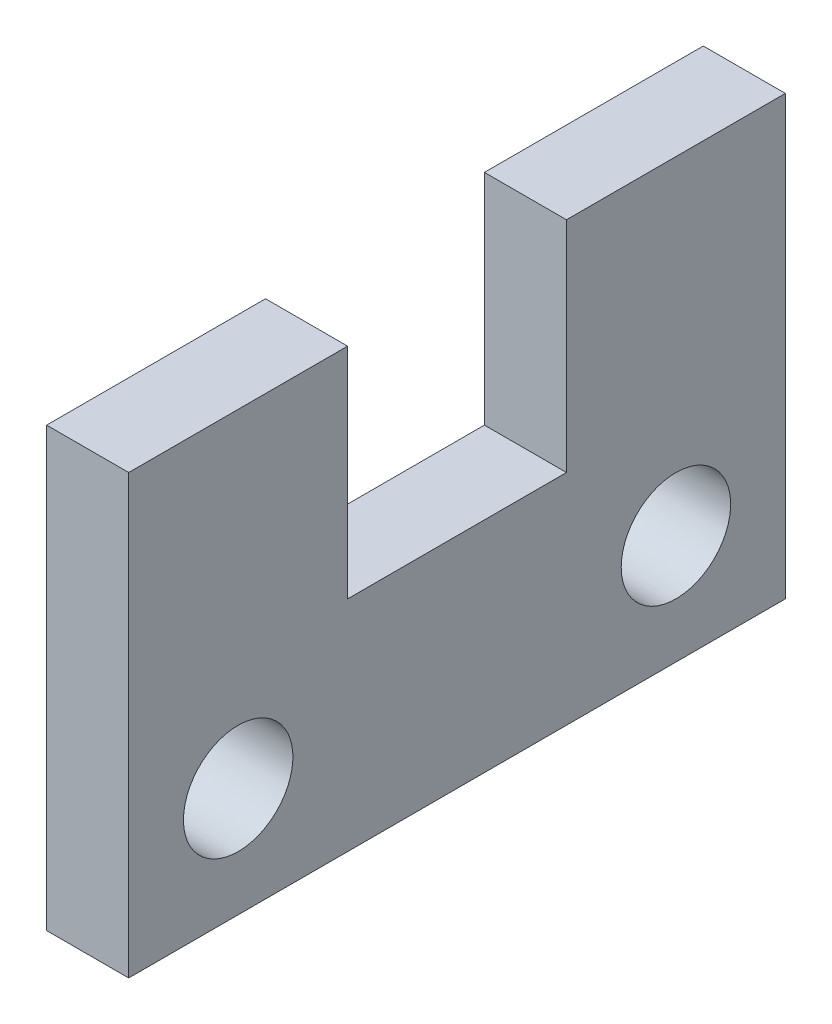
ISO-10303-21;
HEADER;
FILE_DESCRIPTION(('STEP AP214'),'2;1');
FILE_NAME('part.step','',(''),(''),'','','');
FILE_SCHEMA(('AUTOMOTIVE_DESIGN { 1 0 10303 214 1 1 1 1 }'));
ENDSEC;
DATA;
#1=APPLICATION_CONTEXT('core data for automotive mechanical design processes');
#2=APPLICATION_PROTOCOL_DEFINITION('international standard','automotive_design',2000,#1);
#3=PRODUCT_CONTEXT('',#1,'mechanical');
#4=PRODUCT('Part','Part','',(#3));
#5=PRODUCT_RELATED_PRODUCT_CATEGORY('part','',(#4));
#6=PRODUCT_DEFINITION_FORMATION('','',#4);
#7=PRODUCT_DEFINITION_CONTEXT('part definition',#1,'design');
#8=PRODUCT_DEFINITION('design','',#6,#7);
#9=PRODUCT_DEFINITION_SHAPE('','',#8);
#10=(LENGTH_UNIT() NAMED_UNIT(*) SI_UNIT(.MILLI.,.METRE.));
#11=(NAMED_UNIT(*) PLANE_ANGLE_UNIT() SI_UNIT($,.RADIAN.));
#12=(NAMED_UNIT(*) SI_UNIT($,.STERADIAN.) SOLID_ANGLE_UNIT());
#13=UNCERTAINTY_MEASURE_WITH_UNIT(LENGTH_MEASURE(1.E-05),#10,'distance_accuracy_value','');
#14=(GEOMETRIC_REPRESENTATION_CONTEXT(3) GLOBAL_UNCERTAINTY_ASSIGNED_CONTEXT((#13)) GLOBAL_UNIT_ASSIGNED_CONTEXT((#10,
#11,#12)) REPRESENTATION_CONTEXT('',''));
#15=CARTESIAN_POINT('',(0.,0.,0.));
#16=DIRECTION('',(0.,0.,1.));
#17=DIRECTION('',(1.,0.,0.));
#18=AXIS2_PLACEMENT_3D('',#15,#16,#17);
#19=CARTESIAN_POINT('',(15.,80.,0.));
#20=DIRECTION('',(0.,0.,-1.));
#21=DIRECTION('',(0.,1.,0.));
#22=AXIS2_PLACEMENT_3D('',#19,#20,#21);
#23=PLANE('',#22);
#24=DIRECTION('',(0.,-1.,0.));
#25=VECTOR('',#24,1.);
#26=CARTESIAN_POINT('',(0.,80.,0.));
#27=LINE('',#26,#25);
#28=CARTESIAN_POINT('',(0.,80.,0.));
#29=VERTEX_POINT('',#28);
#30=CARTESIAN_POINT('',(0.,0.,0.));
#31=VERTEX_POINT('',#30);
#32=EDGE_CURVE('E140',#29,#31,#27,.T.);
#33=ORIENTED_EDGE('',*,*,#32,.T.);
#34=DIRECTION('',(-1.,0.,0.));
#35=VECTOR('',#34,1.);
#36=CARTESIAN_POINT('',(15.,0.,0.));
#37=LINE('',#36,#35);
#38=CARTESIAN_POINT('',(15.,0.,0.));
#39=VERTEX_POINT('',#38);
#40=EDGE_CURVE('E11',#39,#31,#37,.T.);
#41=ORIENTED_EDGE('',*,*,#40,.F.);
#42=DIRECTION('',(0.,-1.,0.));
#43=VECTOR('',#42,1.);
#44=CARTESIAN_POINT('',(15.,80.,0.));
#45=LINE('',#44,#43);
#46=CARTESIAN_POINT('',(15.,80.,0.));
#47=VERTEX_POINT('',#46);
#48=EDGE_CURVE('E163',#47,#39,#45,.T.);
#49=ORIENTED_EDGE('',*,*,#48,.F.);
#50=DIRECTION('',(-1.,0.,0.));
#51=VECTOR('',#50,1.);
#52=CARTESIAN_POINT('',(15.,80.,0.));
#53=LINE('',#52,#51);
#54=EDGE_CURVE('E136',#47,#29,#53,.T.);
#55=ORIENTED_EDGE('',*,*,#54,.T.);
#56=EDGE_LOOP('',(#33,#41,#49,#55));
#57=FACE_BOUND('',#56,.T.);
#58=ADVANCED_FACE('F39',(#57),#23,.F.);
#59=CARTESIAN_POINT('',(15.,0.,0.));
#60=DIRECTION('',(0.,1.,0.));
#61=DIRECTION('',(0.,0.,1.));
#62=AXIS2_PLACEMENT_3D('',#59,#60,#61);
#63=PLANE('',#62);
#64=DIRECTION('',(0.,0.,-1.));
#65=VECTOR('',#64,1.);
#66=CARTESIAN_POINT('',(0.,0.,0.));
#67=LINE('',#66,#65);
#68=CARTESIAN_POINT('',(0.,0.,-120.));
#69=VERTEX_POINT('',#68);
#70=EDGE_CURVE('E144',#31,#69,#67,.T.);
#71=ORIENTED_EDGE('',*,*,#70,.T.);
#72=DIRECTION('',(-1.,0.,0.));
#73=VECTOR('',#72,1.);
#74=CARTESIAN_POINT('',(15.,0.,-120.));
#75=LINE('',#74,#73);
#76=CARTESIAN_POINT('',(15.,0.,-120.));
#77=VERTEX_POINT('',#76);
#78=EDGE_CURVE('E48',#77,#69,#75,.T.);
#79=ORIENTED_EDGE('',*,*,#78,.F.);
#80=DIRECTION('',(0.,0.,-1.));
#81=VECTOR('',#80,1.);
#82=CARTESIAN_POINT('',(15.,0.,0.));
#83=LINE('',#82,#81);
#84=EDGE_CURVE('E99',#39,#77,#83,.T.);
#85=ORIENTED_EDGE('',*,*,#84,.F.);
#86=ORIENTED_EDGE('',*,*,#40,.T.);
#87=EDGE_LOOP('',(#71,#79,#85,#86));
#88=FACE_BOUND('',#87,.T.);
#89=ADVANCED_FACE('F245',(#88),#63,.F.);
#90=CARTESIAN_POINT('',(15.,0.,-120.));
#91=DIRECTION('',(0.,0.,1.));
#92=DIRECTION('',(1.,0.,0.));
#93=AXIS2_PLACEMENT_3D('',#90,#91,#92);
#94=PLANE('',#93);
#95=DIRECTION('',(0.,1.,0.));
#96=VECTOR('',#95,1.);
#97=CARTESIAN_POINT('',(0.,0.,-120.));
#98=LINE('',#97,#96);
#99=CARTESIAN_POINT('',(0.,80.,-120.));
#100=VERTEX_POINT('',#99);
#101=EDGE_CURVE('E148',#69,#100,#98,.T.);
#102=ORIENTED_EDGE('',*,*,#101,.T.);
#103=DIRECTION('',(-1.,0.,0.));
#104=VECTOR('',#103,1.);
#105=CARTESIAN_POINT('',(15.,80.,-120.));
#106=LINE('',#105,#104);
#107=CARTESIAN_POINT('',(15.,80.,-120.));
#108=VERTEX_POINT('',#107);
#109=EDGE_CURVE('E174',#108,#100,#106,.T.);
#110=ORIENTED_EDGE('',*,*,#109,.F.);
#111=DIRECTION('',(0.,1.,0.));
#112=VECTOR('',#111,1.);
#113=CARTESIAN_POINT('',(15.,0.,-120.));
#114=LINE('',#113,#112);
#115=EDGE_CURVE('E184',#77,#108,#114,.T.);
#116=ORIENTED_EDGE('',*,*,#115,.F.);
#117=ORIENTED_EDGE('',*,*,#78,.T.);
#118=EDGE_LOOP('',(#102,#110,#116,#117));
#119=FACE_BOUND('',#118,.T.);
#120=ADVANCED_FACE('F182',(#119),#94,.F.);
#121=CARTESIAN_POINT('',(15.,80.,-120.));
#122=DIRECTION('',(0.,-1.,0.));
#123=DIRECTION('',(0.,0.,-1.));
#124=AXIS2_PLACEMENT_3D('',#121,#122,#123);
#125=PLANE('',#124);
#126=DIRECTION('',(0.,0.,1.));
#127=VECTOR('',#126,1.);
#128=CARTESIAN_POINT('',(0.,80.,-120.));
#129=LINE('',#128,#127);
#130=CARTESIAN_POINT('',(0.,80.,-80.));
#131=VERTEX_POINT('',#130);
#132=EDGE_CURVE('E151',#100,#131,#129,.T.);
#133=ORIENTED_EDGE('',*,*,#132,.T.);
#134=DIRECTION('',(-1.,0.,0.));
#135=VECTOR('',#134,1.);
#136=CARTESIAN_POINT('',(15.,80.,-80.));
#137=LINE('',#136,#135);
#138=CARTESIAN_POINT('',(15.,80.,-80.));
#139=VERTEX_POINT('',#138);
#140=EDGE_CURVE('E170',#139,#131,#137,.T.);
#141=ORIENTED_EDGE('',*,*,#140,.F.);
#142=DIRECTION('',(0.,0.,1.));
#143=VECTOR('',#142,1.);
#144=CARTESIAN_POINT('',(15.,80.,-120.));
#145=LINE('',#144,#143);
#146=EDGE_CURVE('E197',#108,#139,#145,.T.);
#147=ORIENTED_EDGE('',*,*,#146,.F.);
#148=ORIENTED_EDGE('',*,*,#109,.T.);
#149=EDGE_LOOP('',(#133,#141,#147,#148));
#150=FACE_BOUND('',#149,.T.);
#151=ADVANCED_FACE('F192',(#150),#125,.F.);
#152=CARTESIAN_POINT('',(15.,80.,-80.));
#153=DIRECTION('',(0.,0.,-1.));
#154=DIRECTION('',(-1.,0.,0.));
#155=AXIS2_PLACEMENT_3D('',#152,#153,#154);
#156=PLANE('',#155);
#157=DIRECTION('',(0.,-1.,0.));
#158=VECTOR('',#157,1.);
#159=CARTESIAN_POINT('',(0.,80.,-80.));
#160=LINE('',#159,#158);
#161=CARTESIAN_POINT('',(0.,40.,-80.));
#162=VERTEX_POINT('',#161);
#163=EDGE_CURVE('E154',#131,#162,#160,.T.);
#164=ORIENTED_EDGE('',*,*,#163,.T.);
#165=DIRECTION('',(-1.,0.,0.));
#166=VECTOR('',#165,1.);
#167=CARTESIAN_POINT('',(15.,40.,-80.));
#168=LINE('',#167,#166);
#169=CARTESIAN_POINT('',(15.,40.,-80.));
#170=VERTEX_POINT('',#169);
#171=EDGE_CURVE('E129',#170,#162,#168,.T.);
#172=ORIENTED_EDGE('',*,*,#171,.F.);
#173=DIRECTION('',(0.,-1.,0.));
#174=VECTOR('',#173,1.);
#175=CARTESIAN_POINT('',(15.,80.,-80.));
#176=LINE('',#175,#174);
#177=EDGE_CURVE('E118',#139,#170,#176,.T.);
#178=ORIENTED_EDGE('',*,*,#177,.F.);
#179=ORIENTED_EDGE('',*,*,#140,.T.);
#180=EDGE_LOOP('',(#164,#172,#178,#179));
#181=FACE_BOUND('',#180,.T.);
#182=ADVANCED_FACE('F195',(#181),#156,.F.);
#183=CARTESIAN_POINT('',(15.,40.,-80.));
#184=DIRECTION('',(0.,-1.,0.));
#185=DIRECTION('',(0.,0.,-1.));
#186=AXIS2_PLACEMENT_3D('',#183,#184,#185);
#187=PLANE('',#186);
#188=DIRECTION('',(0.,0.,1.));
#189=VECTOR('',#188,1.);
#190=CARTESIAN_POINT('',(0.,40.,-80.));
#191=LINE('',#190,#189);
#192=CARTESIAN_POINT('',(0.,40.,-40.));
#193=VERTEX_POINT('',#192);
#194=EDGE_CURVE('E127',#162,#193,#191,.T.);
#195=ORIENTED_EDGE('',*,*,#194,.T.);
#196=DIRECTION('',(-1.,0.,0.));
#197=VECTOR('',#196,1.);
#198=CARTESIAN_POINT('',(15.,40.,-40.));
#199=LINE('',#198,#197);
#200=CARTESIAN_POINT('',(15.,40.,-40.));
#201=VERTEX_POINT('',#200);
#202=EDGE_CURVE('E124',#201,#193,#199,.T.);
#203=ORIENTED_EDGE('',*,*,#202,.F.);
#204=DIRECTION('',(0.,0.,1.));
#205=VECTOR('',#204,1.);
#206=CARTESIAN_POINT('',(15.,40.,-80.));
#207=LINE('',#206,#205);
#208=EDGE_CURVE('E112',#170,#201,#207,.T.);
#209=ORIENTED_EDGE('',*,*,#208,.F.);
#210=ORIENTED_EDGE('',*,*,#171,.T.);
#211=EDGE_LOOP('',(#195,#203,#209,#210));
#212=FACE_BOUND('',#211,.T.);
#213=ADVANCED_FACE('F125',(#212),#187,.F.);
#214=CARTESIAN_POINT('',(15.,40.,-40.));
#215=DIRECTION('',(0.,0.,1.));
#216=DIRECTION('',(0.,-1.,0.));
#217=AXIS2_PLACEMENT_3D('',#214,#215,#216);
#218=PLANE('',#217);
#219=DIRECTION('',(0.,1.,0.));
#220=VECTOR('',#219,1.);
#221=CARTESIAN_POINT('',(0.,40.,-40.));
#222=LINE('',#221,#220);
#223=CARTESIAN_POINT('',(0.,80.,-40.));
#224=VERTEX_POINT('',#223);
#225=EDGE_CURVE('E85',#193,#224,#222,.T.);
#226=ORIENTED_EDGE('',*,*,#225,.T.);
#227=DIRECTION('',(-1.,0.,0.));
#228=VECTOR('',#227,1.);
#229=CARTESIAN_POINT('',(15.,80.,-40.));
#230=LINE('',#229,#228);
#231=CARTESIAN_POINT('',(15.,80.,-40.));
#232=VERTEX_POINT('',#231);
#233=EDGE_CURVE('E130',#232,#224,#230,.T.);
#234=ORIENTED_EDGE('',*,*,#233,.F.);
#235=DIRECTION('',(0.,1.,0.));
#236=VECTOR('',#235,1.);
#237=CARTESIAN_POINT('',(15.,40.,-40.));
#238=LINE('',#237,#236);
#239=EDGE_CURVE('E116',#201,#232,#238,.T.);
#240=ORIENTED_EDGE('',*,*,#239,.F.);
#241=ORIENTED_EDGE('',*,*,#202,.T.);
#242=EDGE_LOOP('',(#226,#234,#240,#241));
#243=FACE_BOUND('',#242,.T.);
#244=ADVANCED_FACE('F132',(#243),#218,.F.);
#245=CARTESIAN_POINT('',(15.,80.,-40.));
#246=DIRECTION('',(0.,-1.,0.));
#247=DIRECTION('',(0.,0.,-1.));
#248=AXIS2_PLACEMENT_3D('',#245,#246,#247);
#249=PLANE('',#248);
#250=DIRECTION('',(0.,0.,1.));
#251=VECTOR('',#250,1.);
#252=CARTESIAN_POINT('',(0.,80.,-40.));
#253=LINE('',#252,#251);
#254=EDGE_CURVE('E91',#224,#29,#253,.T.);
#255=ORIENTED_EDGE('',*,*,#254,.T.);
#256=ORIENTED_EDGE('',*,*,#54,.F.);
#257=DIRECTION('',(0.,0.,1.));
#258=VECTOR('',#257,1.);
#259=CARTESIAN_POINT('',(15.,80.,-40.));
#260=LINE('',#259,#258);
#261=EDGE_CURVE('E56',#232,#47,#260,.T.);
#262=ORIENTED_EDGE('',*,*,#261,.F.);
#263=ORIENTED_EDGE('',*,*,#233,.T.);
#264=EDGE_LOOP('',(#255,#256,#262,#263));
#265=FACE_BOUND('',#264,.T.);
#266=ADVANCED_FACE('F252',(#265),#249,.F.);
#267=CARTESIAN_POINT('',(15.,0.,0.));
#268=DIRECTION('',(1.,0.,0.));
#269=DIRECTION('',(0.,0.,-1.));
#270=AXIS2_PLACEMENT_3D('',#267,#268,#269);
#271=PLANE('',#270);
#272=CARTESIAN_POINT('',(15.,20.,-100.));
#273=DIRECTION('',(-1.,0.,0.));
#274=DIRECTION('',(0.,0.,1.));
#275=AXIS2_PLACEMENT_3D('',#272,#273,#274);
#276=CIRCLE('',#275,9.99999999999999);
#277=CARTESIAN_POINT('',(15.,20.,-90.));
#278=VERTEX_POINT('',#277);
#279=EDGE_CURVE('E145',#278,#278,#276,.T.);
#280=ORIENTED_EDGE('',*,*,#279,.T.);
#281=EDGE_LOOP('',(#280));
#282=FACE_BOUND('',#281,.T.);
#283=CARTESIAN_POINT('',(15.,20.,-20.));
#284=DIRECTION('',(-1.,0.,0.));
#285=DIRECTION('',(0.,0.,1.));
#286=AXIS2_PLACEMENT_3D('',#283,#284,#285);
#287=CIRCLE('',#286,10.);
#288=CARTESIAN_POINT('',(15.,20.,-9.99999999999999));
#289=VERTEX_POINT('',#288);
#290=EDGE_CURVE('E211',#289,#289,#287,.T.);
#291=ORIENTED_EDGE('',*,*,#290,.T.);
#292=EDGE_LOOP('',(#291));
#293=FACE_BOUND('',#292,.T.);
#294=ORIENTED_EDGE('',*,*,#48,.T.);
#295=ORIENTED_EDGE('',*,*,#84,.T.);
#296=ORIENTED_EDGE('',*,*,#115,.T.);
#297=ORIENTED_EDGE('',*,*,#146,.T.);
#298=ORIENTED_EDGE('',*,*,#177,.T.);
#299=ORIENTED_EDGE('',*,*,#208,.T.);
#300=ORIENTED_EDGE('',*,*,#239,.T.);
#301=ORIENTED_EDGE('',*,*,#261,.T.);
#302=EDGE_LOOP('',(#294,#295,#296,#297,#298,#299,#300,#301));
#303=FACE_BOUND('',#302,.T.);
#304=ADVANCED_FACE('F114',(#282,#293,#303),#271,.T.);
#305=CARTESIAN_POINT('',(0.,0.,0.));
#306=DIRECTION('',(1.,0.,0.));
#307=DIRECTION('',(0.,0.,-1.));
#308=AXIS2_PLACEMENT_3D('',#305,#306,#307);
#309=PLANE('',#308);
#310=CARTESIAN_POINT('',(0.,20.,-100.));
#311=DIRECTION('',(-1.,0.,0.));
#312=DIRECTION('',(0.,0.,1.));
#313=AXIS2_PLACEMENT_3D('',#310,#311,#312);
#314=CIRCLE('',#313,9.99999999999999);
#315=CARTESIAN_POINT('',(0.,20.,-90.));
#316=VERTEX_POINT('',#315);
#317=EDGE_CURVE('E215',#316,#316,#314,.T.);
#318=ORIENTED_EDGE('',*,*,#317,.F.);
#319=EDGE_LOOP('',(#318));
#320=FACE_BOUND('',#319,.T.);
#321=CARTESIAN_POINT('',(0.,20.,-20.));
#322=DIRECTION('',(-1.,0.,0.));
#323=DIRECTION('',(0.,0.,1.));
#324=AXIS2_PLACEMENT_3D('',#321,#322,#323);
#325=CIRCLE('',#324,10.);
#326=CARTESIAN_POINT('',(0.,20.,-9.99999999999999));
#327=VERTEX_POINT('',#326);
#328=EDGE_CURVE('E207',#327,#327,#325,.T.);
#329=ORIENTED_EDGE('',*,*,#328,.F.);
#330=EDGE_LOOP('',(#329));
#331=FACE_BOUND('',#330,.T.);
#332=ORIENTED_EDGE('',*,*,#32,.F.);
#333=ORIENTED_EDGE('',*,*,#254,.F.);
#334=ORIENTED_EDGE('',*,*,#225,.F.);
#335=ORIENTED_EDGE('',*,*,#194,.F.);
#336=ORIENTED_EDGE('',*,*,#163,.F.);
#337=ORIENTED_EDGE('',*,*,#132,.F.);
#338=ORIENTED_EDGE('',*,*,#101,.F.);
#339=ORIENTED_EDGE('',*,*,#70,.F.);
#340=EDGE_LOOP('',(#332,#333,#334,#335,#336,#337,#338,#339));
#341=FACE_BOUND('',#340,.T.);
#342=ADVANCED_FACE('F188',(#320,#331,#341),#309,.F.);
#343=CARTESIAN_POINT('',(15.,20.,-20.));
#344=DIRECTION('',(-1.,0.,0.));
#345=DIRECTION('',(0.,0.,1.));
#346=AXIS2_PLACEMENT_3D('',#343,#344,#345);
#347=CYLINDRICAL_SURFACE('',#346,10.);
#348=ORIENTED_EDGE('',*,*,#290,.F.);
#349=EDGE_LOOP('',(#348));
#350=FACE_BOUND('',#349,.T.);
#351=ORIENTED_EDGE('',*,*,#328,.T.);
#352=EDGE_LOOP('',(#351));
#353=FACE_BOUND('',#352,.T.);
#354=ADVANCED_FACE('F228',(#350,#353),#347,.F.);
#355=CARTESIAN_POINT('',(15.,20.,-100.));
#356=DIRECTION('',(-1.,0.,0.));
#357=DIRECTION('',(0.,0.,1.));
#358=AXIS2_PLACEMENT_3D('',#355,#356,#357);
#359=CYLINDRICAL_SURFACE('',#358,9.99999999999999);
#360=ORIENTED_EDGE('',*,*,#279,.F.);
#361=EDGE_LOOP('',(#360));
#362=FACE_BOUND('',#361,.T.);
#363=ORIENTED_EDGE('',*,*,#317,.T.);
#364=EDGE_LOOP('',(#363));
#365=FACE_BOUND('',#364,.T.);
#366=ADVANCED_FACE('F225',(#362,#365),#359,.F.);
#367=CLOSED_SHELL('',(#58,#89,#120,#151,#182,#213,#244,#266,#304,#342,#354,#366));
#368=MANIFOLD_SOLID_BREP('B2',#367);
#369=ADVANCED_BREP_SHAPE_REPRESENTATION('',(#18,#368),#14);
#370=SHAPE_DEFINITION_REPRESENTATION(#9,#369);
ENDSEC;
END-ISO-10303-21;
